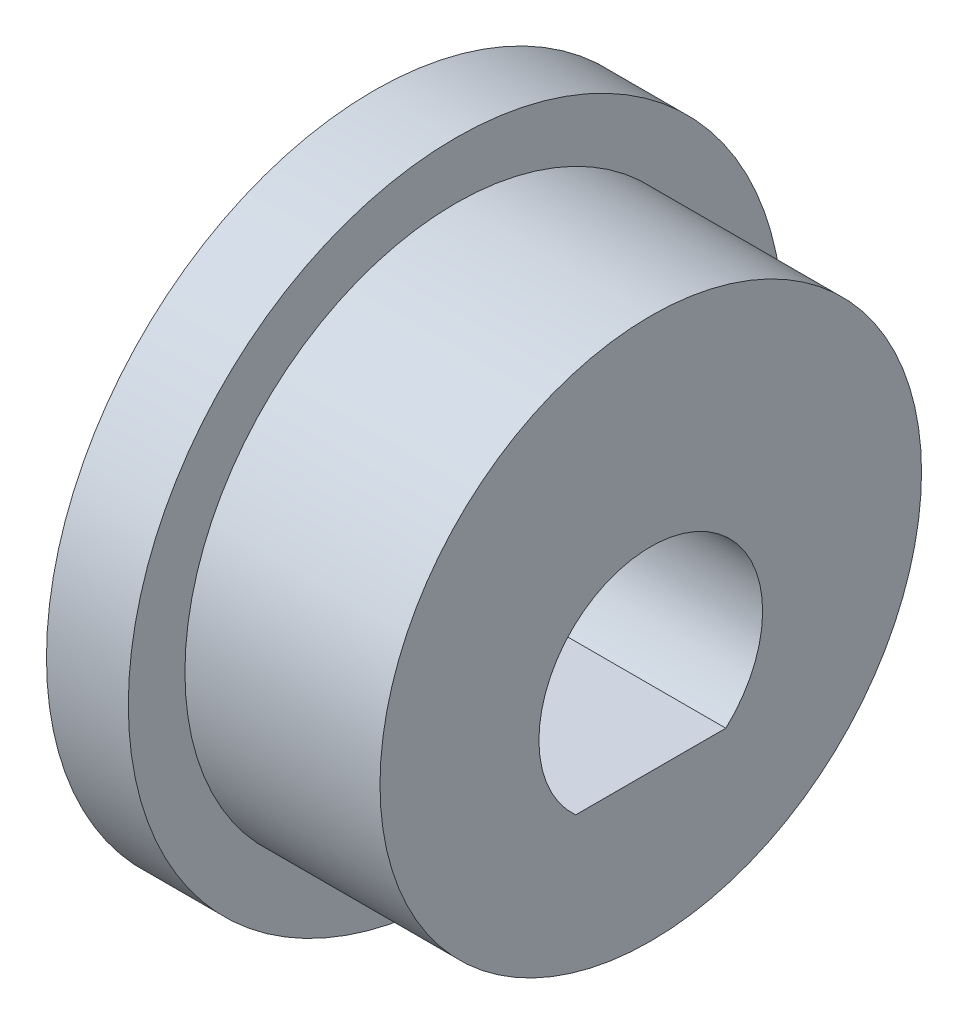
ISO-10303-21;
HEADER;
FILE_DESCRIPTION(('STEP AP214'),'2;1');
FILE_NAME('part.step','',(''),(''),'','','');
FILE_SCHEMA(('AUTOMOTIVE_DESIGN { 1 0 10303 214 1 1 1 1 }'));
ENDSEC;
DATA;
#1=APPLICATION_CONTEXT('core data for automotive mechanical design processes');
#2=APPLICATION_PROTOCOL_DEFINITION('international standard','automotive_design',2000,#1);
#3=PRODUCT_CONTEXT('',#1,'mechanical');
#4=PRODUCT('Part','Part','',(#3));
#5=PRODUCT_RELATED_PRODUCT_CATEGORY('part','',(#4));
#6=PRODUCT_DEFINITION_FORMATION('','',#4);
#7=PRODUCT_DEFINITION_CONTEXT('part definition',#1,'design');
#8=PRODUCT_DEFINITION('design','',#6,#7);
#9=PRODUCT_DEFINITION_SHAPE('','',#8);
#10=(LENGTH_UNIT() NAMED_UNIT(*) SI_UNIT(.MILLI.,.METRE.));
#11=(NAMED_UNIT(*) PLANE_ANGLE_UNIT() SI_UNIT($,.RADIAN.));
#12=(NAMED_UNIT(*) SI_UNIT($,.STERADIAN.) SOLID_ANGLE_UNIT());
#13=UNCERTAINTY_MEASURE_WITH_UNIT(LENGTH_MEASURE(1.E-05),#10,'distance_accuracy_value','');
#14=(GEOMETRIC_REPRESENTATION_CONTEXT(3) GLOBAL_UNCERTAINTY_ASSIGNED_CONTEXT((#13)) GLOBAL_UNIT_ASSIGNED_CONTEXT((#10,
#11,#12)) REPRESENTATION_CONTEXT('',''));
#15=CARTESIAN_POINT('',(0.,0.,0.));
#16=DIRECTION('',(0.,0.,1.));
#17=DIRECTION('',(1.,0.,0.));
#18=AXIS2_PLACEMENT_3D('',#15,#16,#17);
#19=CARTESIAN_POINT('',(7.15,1.5,0.));
#20=DIRECTION('',(-1.,0.,0.));
#21=DIRECTION('',(0.,0.,1.));
#22=AXIS2_PLACEMENT_3D('',#19,#20,#21);
#23=CYLINDRICAL_SURFACE('',#22,9.925);
#24=CARTESIAN_POINT('',(7.15,1.5,0.));
#25=DIRECTION('',(1.,0.,0.));
#26=DIRECTION('',(0.,0.,-1.));
#27=AXIS2_PLACEMENT_3D('',#24,#25,#26);
#28=CIRCLE('',#27,9.925);
#29=CARTESIAN_POINT('',(7.15,1.5,-9.925));
#30=VERTEX_POINT('',#29);
#31=EDGE_CURVE('E11',#30,#30,#28,.T.);
#32=ORIENTED_EDGE('',*,*,#31,.F.);
#33=EDGE_LOOP('',(#32));
#34=FACE_BOUND('',#33,.T.);
#35=CARTESIAN_POINT('',(0.,1.5,0.));
#36=DIRECTION('',(1.,0.,0.));
#37=DIRECTION('',(0.,0.,-1.));
#38=AXIS2_PLACEMENT_3D('',#35,#36,#37);
#39=CIRCLE('',#38,9.925);
#40=CARTESIAN_POINT('',(0.,1.5,-9.925));
#41=VERTEX_POINT('',#40);
#42=EDGE_CURVE('E47',#41,#41,#39,.T.);
#43=ORIENTED_EDGE('',*,*,#42,.T.);
#44=EDGE_LOOP('',(#43));
#45=FACE_BOUND('',#44,.T.);
#46=ADVANCED_FACE('F41',(#34,#45),#23,.T.);
#47=CARTESIAN_POINT('',(7.15,1.5,0.));
#48=DIRECTION('',(1.,0.,0.));
#49=DIRECTION('',(0.,0.,-1.));
#50=AXIS2_PLACEMENT_3D('',#47,#48,#49);
#51=PLANE('',#50);
#52=CARTESIAN_POINT('',(7.15,0.,0.));
#53=DIRECTION('',(1.,0.,0.));
#54=DIRECTION('',(0.,0.,-1.));
#55=AXIS2_PLACEMENT_3D('',#52,#53,#54);
#56=CIRCLE('',#55,4.1);
#57=CARTESIAN_POINT('',(7.15,-3.04097023990699,-2.75));
#58=VERTEX_POINT('',#57);
#59=CARTESIAN_POINT('',(7.15,-3.04097023990699,2.75));
#60=VERTEX_POINT('',#59);
#61=EDGE_CURVE('E42',#58,#60,#56,.T.);
#62=ORIENTED_EDGE('',*,*,#61,.F.);
#63=DIRECTION('',(0.,0.,-1.));
#64=VECTOR('',#63,1.);
#65=CARTESIAN_POINT('',(7.15,-3.04097023990699,-2.75));
#66=LINE('',#65,#64);
#67=EDGE_CURVE('E81',#60,#58,#66,.T.);
#68=ORIENTED_EDGE('',*,*,#67,.F.);
#69=EDGE_LOOP('',(#62,#68));
#70=FACE_BOUND('',#69,.T.);
#71=ORIENTED_EDGE('',*,*,#31,.T.);
#72=EDGE_LOOP('',(#71));
#73=FACE_BOUND('',#72,.T.);
#74=ADVANCED_FACE('F91',(#70,#73),#51,.T.);
#75=CARTESIAN_POINT('',(-3.,1.5,0.));
#76=DIRECTION('',(1.,0.,0.));
#77=DIRECTION('',(0.,0.,-1.));
#78=AXIS2_PLACEMENT_3D('',#75,#76,#77);
#79=CYLINDRICAL_SURFACE('',#78,12.);
#80=CARTESIAN_POINT('',(-3.,1.5,0.));
#81=DIRECTION('',(-1.,0.,0.));
#82=DIRECTION('',(0.,0.,1.));
#83=AXIS2_PLACEMENT_3D('',#80,#81,#82);
#84=CIRCLE('',#83,12.);
#85=CARTESIAN_POINT('',(-3.,1.5,12.));
#86=VERTEX_POINT('',#85);
#87=EDGE_CURVE('E83',#86,#86,#84,.T.);
#88=ORIENTED_EDGE('',*,*,#87,.F.);
#89=EDGE_LOOP('',(#88));
#90=FACE_BOUND('',#89,.T.);
#91=CARTESIAN_POINT('',(0.,1.5,0.));
#92=DIRECTION('',(-1.,0.,0.));
#93=DIRECTION('',(0.,0.,1.));
#94=AXIS2_PLACEMENT_3D('',#91,#92,#93);
#95=CIRCLE('',#94,12.);
#96=CARTESIAN_POINT('',(0.,1.5,12.));
#97=VERTEX_POINT('',#96);
#98=EDGE_CURVE('E86',#97,#97,#95,.T.);
#99=ORIENTED_EDGE('',*,*,#98,.T.);
#100=EDGE_LOOP('',(#99));
#101=FACE_BOUND('',#100,.T.);
#102=ADVANCED_FACE('F96',(#90,#101),#79,.T.);
#103=CARTESIAN_POINT('',(-3.,1.5,0.));
#104=DIRECTION('',(-1.,0.,0.));
#105=DIRECTION('',(0.,0.,1.));
#106=AXIS2_PLACEMENT_3D('',#103,#104,#105);
#107=PLANE('',#106);
#108=CARTESIAN_POINT('',(-3.,0.,0.));
#109=DIRECTION('',(1.,0.,0.));
#110=DIRECTION('',(0.,0.,-1.));
#111=AXIS2_PLACEMENT_3D('',#108,#109,#110);
#112=CIRCLE('',#111,4.1);
#113=CARTESIAN_POINT('',(-3.,-3.04097023990699,-2.75));
#114=VERTEX_POINT('',#113);
#115=CARTESIAN_POINT('',(-3.,-3.04097023990699,2.75));
#116=VERTEX_POINT('',#115);
#117=EDGE_CURVE('E63',#114,#116,#112,.T.);
#118=ORIENTED_EDGE('',*,*,#117,.T.);
#119=DIRECTION('',(0.,0.,-1.));
#120=VECTOR('',#119,1.);
#121=CARTESIAN_POINT('',(-3.,-3.04097023990699,-2.75));
#122=LINE('',#121,#120);
#123=EDGE_CURVE('E71',#116,#114,#122,.T.);
#124=ORIENTED_EDGE('',*,*,#123,.T.);
#125=EDGE_LOOP('',(#118,#124));
#126=FACE_BOUND('',#125,.T.);
#127=ORIENTED_EDGE('',*,*,#87,.T.);
#128=EDGE_LOOP('',(#127));
#129=FACE_BOUND('',#128,.T.);
#130=ADVANCED_FACE('F76',(#126,#129),#107,.T.);
#131=CARTESIAN_POINT('',(0.,1.5,0.));
#132=DIRECTION('',(-1.,0.,0.));
#133=DIRECTION('',(0.,0.,1.));
#134=AXIS2_PLACEMENT_3D('',#131,#132,#133);
#135=PLANE('',#134);
#136=ORIENTED_EDGE('',*,*,#42,.F.);
#137=EDGE_LOOP('',(#136));
#138=FACE_BOUND('',#137,.T.);
#139=ORIENTED_EDGE('',*,*,#98,.F.);
#140=EDGE_LOOP('',(#139));
#141=FACE_BOUND('',#140,.T.);
#142=ADVANCED_FACE('F103',(#138,#141),#135,.F.);
#143=CARTESIAN_POINT('',(-3.,0.,0.));
#144=DIRECTION('',(1.,0.,0.));
#145=DIRECTION('',(0.,0.,-1.));
#146=AXIS2_PLACEMENT_3D('',#143,#144,#145);
#147=CYLINDRICAL_SURFACE('',#146,4.1);
#148=ORIENTED_EDGE('',*,*,#61,.T.);
#149=DIRECTION('',(1.,0.,0.));
#150=VECTOR('',#149,1.);
#151=CARTESIAN_POINT('',(-3.,-3.04097023990699,2.75));
#152=LINE('',#151,#150);
#153=EDGE_CURVE('E60',#116,#60,#152,.T.);
#154=ORIENTED_EDGE('',*,*,#153,.F.);
#155=ORIENTED_EDGE('',*,*,#117,.F.);
#156=DIRECTION('',(1.,0.,0.));
#157=VECTOR('',#156,1.);
#158=CARTESIAN_POINT('',(-3.,-3.04097023990699,-2.75));
#159=LINE('',#158,#157);
#160=EDGE_CURVE('E75',#114,#58,#159,.T.);
#161=ORIENTED_EDGE('',*,*,#160,.T.);
#162=EDGE_LOOP('',(#148,#154,#155,#161));
#163=FACE_BOUND('',#162,.T.);
#164=ADVANCED_FACE('F66',(#163),#147,.F.);
#165=CARTESIAN_POINT('',(-3.,-3.04097023990699,-2.75));
#166=DIRECTION('',(0.,-1.,0.));
#167=DIRECTION('',(0.,0.,-1.));
#168=AXIS2_PLACEMENT_3D('',#165,#166,#167);
#169=PLANE('',#168);
#170=ORIENTED_EDGE('',*,*,#67,.T.);
#171=ORIENTED_EDGE('',*,*,#160,.F.);
#172=ORIENTED_EDGE('',*,*,#123,.F.);
#173=ORIENTED_EDGE('',*,*,#153,.T.);
#174=EDGE_LOOP('',(#170,#171,#172,#173));
#175=FACE_BOUND('',#174,.T.);
#176=ADVANCED_FACE('F77',(#175),#169,.F.);
#177=CLOSED_SHELL('',(#46,#74,#102,#130,#142,#164,#176));
#178=MANIFOLD_SOLID_BREP('B2',#177);
#179=ADVANCED_BREP_SHAPE_REPRESENTATION('',(#18,#178),#14);
#180=SHAPE_DEFINITION_REPRESENTATION(#9,#179);
ENDSEC;
END-ISO-10303-21;
